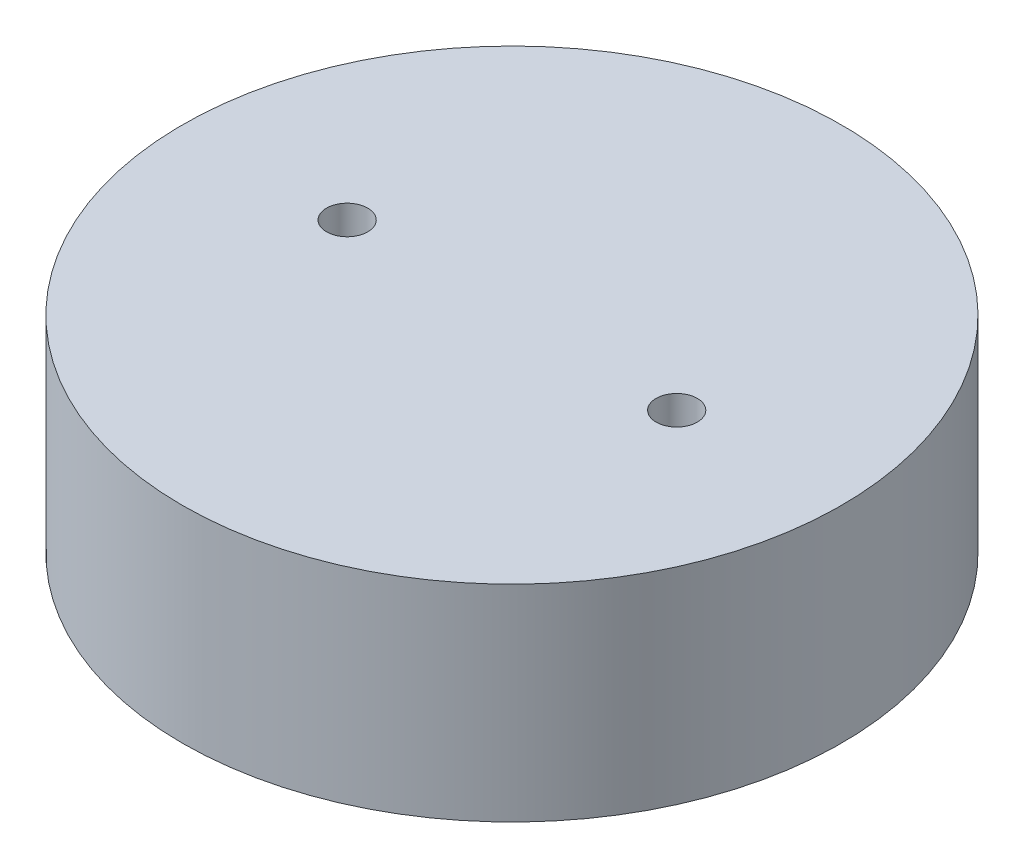
ISO-10303-21;
HEADER;
FILE_DESCRIPTION(('STEP AP214'),'2;1');
FILE_NAME('part.step','',(''),(''),'','','');
FILE_SCHEMA(('AUTOMOTIVE_DESIGN { 1 0 10303 214 1 1 1 1 }'));
ENDSEC;
DATA;
#1=APPLICATION_CONTEXT('core data for automotive mechanical design processes');
#2=APPLICATION_PROTOCOL_DEFINITION('international standard','automotive_design',2000,#1);
#3=PRODUCT_CONTEXT('',#1,'mechanical');
#4=PRODUCT('Part','Part','',(#3));
#5=PRODUCT_RELATED_PRODUCT_CATEGORY('part','',(#4));
#6=PRODUCT_DEFINITION_FORMATION('','',#4);
#7=PRODUCT_DEFINITION_CONTEXT('part definition',#1,'design');
#8=PRODUCT_DEFINITION('design','',#6,#7);
#9=PRODUCT_DEFINITION_SHAPE('','',#8);
#10=(LENGTH_UNIT() NAMED_UNIT(*) SI_UNIT(.MILLI.,.METRE.));
#11=(NAMED_UNIT(*) PLANE_ANGLE_UNIT() SI_UNIT($,.RADIAN.));
#12=(NAMED_UNIT(*) SI_UNIT($,.STERADIAN.) SOLID_ANGLE_UNIT());
#13=UNCERTAINTY_MEASURE_WITH_UNIT(LENGTH_MEASURE(1.E-05),#10,'distance_accuracy_value','');
#14=(GEOMETRIC_REPRESENTATION_CONTEXT(3) GLOBAL_UNCERTAINTY_ASSIGNED_CONTEXT((#13)) GLOBAL_UNIT_ASSIGNED_CONTEXT((#10,
#11,#12)) REPRESENTATION_CONTEXT('',''));
#15=CARTESIAN_POINT('',(0.,0.,0.));
#16=DIRECTION('',(0.,0.,1.));
#17=DIRECTION('',(1.,0.,0.));
#18=AXIS2_PLACEMENT_3D('',#15,#16,#17);
#19=CARTESIAN_POINT('',(0.,-25.,0.));
#20=DIRECTION('',(0.,1.,0.));
#21=DIRECTION('',(0.,0.,1.));
#22=AXIS2_PLACEMENT_3D('',#19,#20,#21);
#23=CYLINDRICAL_SURFACE('',#22,40.);
#24=CARTESIAN_POINT('',(0.,-25.,0.));
#25=DIRECTION('',(0.,1.,0.));
#26=DIRECTION('',(0.,0.,1.));
#27=AXIS2_PLACEMENT_3D('',#24,#25,#26);
#28=CIRCLE('',#27,40.);
#29=CARTESIAN_POINT('',(0.,-25.,40.));
#30=VERTEX_POINT('',#29);
#31=EDGE_CURVE('E10',#30,#30,#28,.T.);
#32=ORIENTED_EDGE('',*,*,#31,.T.);
#33=EDGE_LOOP('',(#32));
#34=FACE_BOUND('',#33,.T.);
#35=CARTESIAN_POINT('',(0.,0.,0.));
#36=DIRECTION('',(0.,1.,0.));
#37=DIRECTION('',(0.,0.,1.));
#38=AXIS2_PLACEMENT_3D('',#35,#36,#37);
#39=CIRCLE('',#38,40.);
#40=CARTESIAN_POINT('',(0.,0.,40.));
#41=VERTEX_POINT('',#40);
#42=EDGE_CURVE('E34',#41,#41,#39,.T.);
#43=ORIENTED_EDGE('',*,*,#42,.F.);
#44=EDGE_LOOP('',(#43));
#45=FACE_BOUND('',#44,.T.);
#46=ADVANCED_FACE('F31',(#34,#45),#23,.T.);
#47=CARTESIAN_POINT('',(0.,-25.,0.));
#48=DIRECTION('',(0.,1.,0.));
#49=DIRECTION('',(0.,0.,1.));
#50=AXIS2_PLACEMENT_3D('',#47,#48,#49);
#51=PLANE('',#50);
#52=CARTESIAN_POINT('',(20.,-25.,0.));
#53=DIRECTION('',(0.,1.,0.));
#54=DIRECTION('',(0.,0.,1.));
#55=AXIS2_PLACEMENT_3D('',#52,#53,#54);
#56=CIRCLE('',#55,2.5);
#57=CARTESIAN_POINT('',(20.,-25.,2.5));
#58=VERTEX_POINT('',#57);
#59=EDGE_CURVE('E46',#58,#58,#56,.T.);
#60=ORIENTED_EDGE('',*,*,#59,.T.);
#61=EDGE_LOOP('',(#60));
#62=FACE_BOUND('',#61,.T.);
#63=CARTESIAN_POINT('',(-20.,-25.,0.));
#64=DIRECTION('',(0.,1.,0.));
#65=DIRECTION('',(0.,0.,1.));
#66=AXIS2_PLACEMENT_3D('',#63,#64,#65);
#67=CIRCLE('',#66,2.5);
#68=CARTESIAN_POINT('',(-20.,-25.,2.5));
#69=VERTEX_POINT('',#68);
#70=EDGE_CURVE('E41',#69,#69,#67,.T.);
#71=ORIENTED_EDGE('',*,*,#70,.T.);
#72=EDGE_LOOP('',(#71));
#73=FACE_BOUND('',#72,.T.);
#74=ORIENTED_EDGE('',*,*,#31,.F.);
#75=EDGE_LOOP('',(#74));
#76=FACE_BOUND('',#75,.T.);
#77=ADVANCED_FACE('F55',(#62,#73,#76),#51,.F.);
#78=CARTESIAN_POINT('',(0.,0.,0.));
#79=DIRECTION('',(0.,1.,0.));
#80=DIRECTION('',(0.,0.,1.));
#81=AXIS2_PLACEMENT_3D('',#78,#79,#80);
#82=PLANE('',#81);
#83=CARTESIAN_POINT('',(20.,0.,0.));
#84=DIRECTION('',(0.,1.,0.));
#85=DIRECTION('',(0.,0.,1.));
#86=AXIS2_PLACEMENT_3D('',#83,#84,#85);
#87=CIRCLE('',#86,2.5);
#88=CARTESIAN_POINT('',(20.,0.,2.5));
#89=VERTEX_POINT('',#88);
#90=EDGE_CURVE('E49',#89,#89,#87,.T.);
#91=ORIENTED_EDGE('',*,*,#90,.F.);
#92=EDGE_LOOP('',(#91));
#93=FACE_BOUND('',#92,.T.);
#94=CARTESIAN_POINT('',(-20.,0.,0.));
#95=DIRECTION('',(0.,1.,0.));
#96=DIRECTION('',(0.,0.,1.));
#97=AXIS2_PLACEMENT_3D('',#94,#95,#96);
#98=CIRCLE('',#97,2.5);
#99=CARTESIAN_POINT('',(-20.,0.,2.5));
#100=VERTEX_POINT('',#99);
#101=EDGE_CURVE('E43',#100,#100,#98,.T.);
#102=ORIENTED_EDGE('',*,*,#101,.F.);
#103=EDGE_LOOP('',(#102));
#104=FACE_BOUND('',#103,.T.);
#105=ORIENTED_EDGE('',*,*,#42,.T.);
#106=EDGE_LOOP('',(#105));
#107=FACE_BOUND('',#106,.T.);
#108=ADVANCED_FACE('F65',(#93,#104,#107),#82,.T.);
#109=CARTESIAN_POINT('',(-20.,-25.,0.));
#110=DIRECTION('',(0.,1.,0.));
#111=DIRECTION('',(0.,0.,1.));
#112=AXIS2_PLACEMENT_3D('',#109,#110,#111);
#113=CYLINDRICAL_SURFACE('',#112,2.5);
#114=ORIENTED_EDGE('',*,*,#70,.F.);
#115=EDGE_LOOP('',(#114));
#116=FACE_BOUND('',#115,.T.);
#117=ORIENTED_EDGE('',*,*,#101,.T.);
#118=EDGE_LOOP('',(#117));
#119=FACE_BOUND('',#118,.T.);
#120=ADVANCED_FACE('F61',(#116,#119),#113,.F.);
#121=CARTESIAN_POINT('',(20.,-25.,0.));
#122=DIRECTION('',(0.,1.,0.));
#123=DIRECTION('',(0.,0.,1.));
#124=AXIS2_PLACEMENT_3D('',#121,#122,#123);
#125=CYLINDRICAL_SURFACE('',#124,2.5);
#126=ORIENTED_EDGE('',*,*,#59,.F.);
#127=EDGE_LOOP('',(#126));
#128=FACE_BOUND('',#127,.T.);
#129=ORIENTED_EDGE('',*,*,#90,.T.);
#130=EDGE_LOOP('',(#129));
#131=FACE_BOUND('',#130,.T.);
#132=ADVANCED_FACE('F58',(#128,#131),#125,.F.);
#133=CLOSED_SHELL('',(#46,#77,#108,#120,#132));
#134=MANIFOLD_SOLID_BREP('B2',#133);
#135=ADVANCED_BREP_SHAPE_REPRESENTATION('',(#18,#134),#14);
#136=SHAPE_DEFINITION_REPRESENTATION(#9,#135);
ENDSEC;
END-ISO-10303-21;
